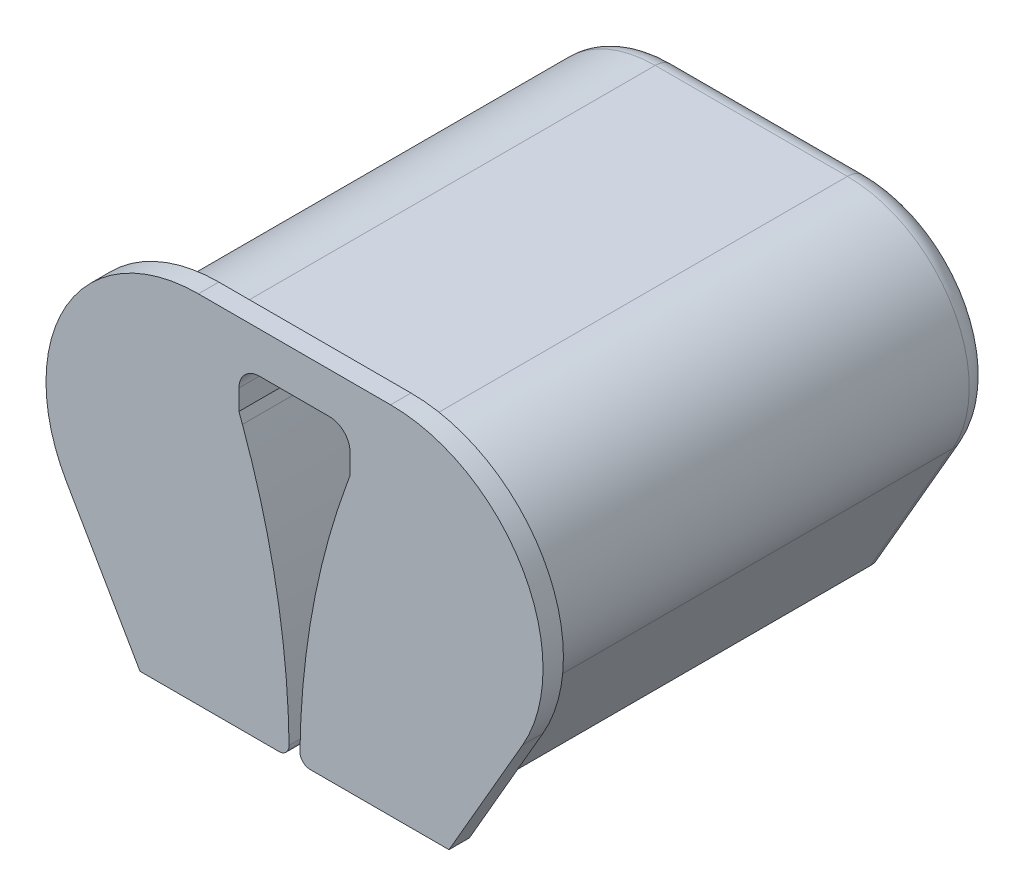
ISO-10303-21;
HEADER;
FILE_DESCRIPTION(('STEP AP214'),'2;1');
FILE_NAME('part.step','',(''),(''),'','','');
FILE_SCHEMA(('AUTOMOTIVE_DESIGN { 1 0 10303 214 1 1 1 1 }'));
ENDSEC;
DATA;
#1=APPLICATION_CONTEXT('core data for automotive mechanical design processes');
#2=APPLICATION_PROTOCOL_DEFINITION('international standard','automotive_design',2000,#1);
#3=PRODUCT_CONTEXT('',#1,'mechanical');
#4=PRODUCT('Part','Part','',(#3));
#5=PRODUCT_RELATED_PRODUCT_CATEGORY('part','',(#4));
#6=PRODUCT_DEFINITION_FORMATION('','',#4);
#7=PRODUCT_DEFINITION_CONTEXT('part definition',#1,'design');
#8=PRODUCT_DEFINITION('design','',#6,#7);
#9=PRODUCT_DEFINITION_SHAPE('','',#8);
#10=(LENGTH_UNIT() NAMED_UNIT(*) SI_UNIT(.MILLI.,.METRE.));
#11=(NAMED_UNIT(*) PLANE_ANGLE_UNIT() SI_UNIT($,.RADIAN.));
#12=(NAMED_UNIT(*) SI_UNIT($,.STERADIAN.) SOLID_ANGLE_UNIT());
#13=UNCERTAINTY_MEASURE_WITH_UNIT(LENGTH_MEASURE(1.E-05),#10,'distance_accuracy_value','');
#14=(GEOMETRIC_REPRESENTATION_CONTEXT(3) GLOBAL_UNCERTAINTY_ASSIGNED_CONTEXT((#13)) GLOBAL_UNIT_ASSIGNED_CONTEXT((#10,
#11,#12)) REPRESENTATION_CONTEXT('',''));
#15=CARTESIAN_POINT('',(0.,0.,0.));
#16=DIRECTION('',(0.,0.,1.));
#17=DIRECTION('',(1.,0.,0.));
#18=AXIS2_PLACEMENT_3D('',#15,#16,#17);
#19=CARTESIAN_POINT('',(0.,0.,-44.9));
#20=DIRECTION('',(0.,0.,-1.));
#21=DIRECTION('',(-1.,0.,0.));
#22=AXIS2_PLACEMENT_3D('',#19,#20,#21);
#23=PLANE('',#22);
#24=CARTESIAN_POINT('',(-76.525,-31.975,-44.9));
#25=DIRECTION('',(0.,0.,1.));
#26=DIRECTION('',(1.,0.,0.));
#27=AXIS2_PLACEMENT_3D('',#24,#25,#26);
#28=CIRCLE('',#27,76.);
#29=CARTESIAN_POINT('',(-0.531755855829166,-30.9616666666667,-44.9));
#30=VERTEX_POINT('',#29);
#31=CARTESIAN_POINT('',(-5.108360820271,-5.98146910724913,-44.9));
#32=VERTEX_POINT('',#31);
#33=EDGE_CURVE('E246',#30,#32,#28,.T.);
#34=ORIENTED_EDGE('',*,*,#33,.F.);
#35=CARTESIAN_POINT('',(-1.53166696298931,-30.975,-44.9));
#36=DIRECTION('',(0.,0.,-1.));
#37=DIRECTION('',(-1.,0.,0.));
#38=AXIS2_PLACEMENT_3D('',#35,#36,#37);
#39=CIRCLE('',#38,1.);
#40=CARTESIAN_POINT('',(-1.53166696298931,-31.975,-44.9));
#41=VERTEX_POINT('',#40);
#42=EDGE_CURVE('E12',#30,#41,#39,.T.);
#43=ORIENTED_EDGE('',*,*,#42,.T.);
#44=DIRECTION('',(1.,0.,0.));
#45=VECTOR('',#44,1.);
#46=CARTESIAN_POINT('',(-11.6887495373797,-31.975,-44.9));
#47=LINE('',#46,#45);
#48=CARTESIAN_POINT('',(-9.26387840678323,-31.975,-44.9));
#49=VERTEX_POINT('',#48);
#50=EDGE_CURVE('E459',#49,#41,#47,.T.);
#51=ORIENTED_EDGE('',*,*,#50,.F.);
#52=DIRECTION('',(0.500000000000001,-0.866025403784438,0.));
#53=VECTOR('',#52,1.);
#54=CARTESIAN_POINT('',(-20.7934899480912,-12.0051270189222,-44.9));
#55=LINE('',#54,#53);
#56=CARTESIAN_POINT('',(-17.9529999580871,-16.925,-44.9));
#57=VERTEX_POINT('',#56);
#58=EDGE_CURVE('E495',#49,#57,#55,.F.);
#59=ORIENTED_EDGE('',*,*,#58,.T.);
#60=CARTESIAN_POINT('',(-9.42264973081042,-12.,-44.9));
#61=DIRECTION('',(0.,0.,-1.));
#62=DIRECTION('',(-1.,0.,0.));
#63=AXIS2_PLACEMENT_3D('',#60,#61,#62);
#64=CIRCLE('',#63,9.84999999999999);
#65=CARTESIAN_POINT('',(-9.42264973081042,-2.15,-44.9));
#66=VERTEX_POINT('',#65);
#67=EDGE_CURVE('E492',#57,#66,#64,.T.);
#68=ORIENTED_EDGE('',*,*,#67,.T.);
#69=DIRECTION('',(-1.,0.,0.));
#70=VECTOR('',#69,1.);
#71=CARTESIAN_POINT('',(0.,-2.15,-44.9));
#72=LINE('',#71,#70);
#73=CARTESIAN_POINT('',(-5.23344495939737,-2.15,-44.9));
#74=VERTEX_POINT('',#73);
#75=EDGE_CURVE('E488',#66,#74,#72,.F.);
#76=ORIENTED_EDGE('',*,*,#75,.T.);
#77=CARTESIAN_POINT('',(-3.44738784944819,-3.05,-44.9));
#78=DIRECTION('',(0.,0.,1.));
#79=DIRECTION('',(1.,0.,0.));
#80=AXIS2_PLACEMENT_3D('',#77,#78,#79);
#81=CIRCLE('',#80,2.);
#82=CARTESIAN_POINT('',(-5.44738784944819,-3.05,-44.9));
#83=VERTEX_POINT('',#82);
#84=EDGE_CURVE('E293',#74,#83,#81,.T.);
#85=ORIENTED_EDGE('',*,*,#84,.T.);
#86=DIRECTION('',(0.,1.,0.));
#87=VECTOR('',#86,1.);
#88=CARTESIAN_POINT('',(-5.44738784944819,-5.05,-44.9));
#89=LINE('',#88,#87);
#90=CARTESIAN_POINT('',(-5.44738784944819,-5.05,-44.9));
#91=VERTEX_POINT('',#90);
#92=EDGE_CURVE('E290',#91,#83,#89,.T.);
#93=ORIENTED_EDGE('',*,*,#92,.F.);
#94=DIRECTION('',(-0.342020143325666,0.939692620785909,0.));
#95=VECTOR('',#94,1.);
#96=CARTESIAN_POINT('',(-5.108360820271,-5.98146910724913,-44.9));
#97=LINE('',#96,#95);
#98=EDGE_CURVE('E287',#32,#91,#97,.T.);
#99=ORIENTED_EDGE('',*,*,#98,.F.);
#100=EDGE_LOOP('',(#34,#43,#51,#59,#68,#76,#85,#93,#99));
#101=FACE_BOUND('',#100,.T.);
#102=ADVANCED_FACE('F48',(#101),#23,.T.);
#103=CARTESIAN_POINT('',(1.53166696298931,-31.975,-44.9));
#104=VERTEX_POINT('',#103);
#105=CARTESIAN_POINT('',(9.26387840678322,-31.975,-44.9));
#106=VERTEX_POINT('',#105);
#107=EDGE_CURVE('E463',#104,#106,#47,.T.);
#108=ORIENTED_EDGE('',*,*,#107,.F.);
#109=CARTESIAN_POINT('',(1.53166696298931,-30.975,-44.9));
#110=DIRECTION('',(0.,0.,-1.));
#111=DIRECTION('',(-1.,0.,0.));
#112=AXIS2_PLACEMENT_3D('',#109,#110,#111);
#113=CIRCLE('',#112,1.);
#114=CARTESIAN_POINT('',(0.531755855829166,-30.9616666666667,-44.9));
#115=VERTEX_POINT('',#114);
#116=EDGE_CURVE('E545',#104,#115,#113,.T.);
#117=ORIENTED_EDGE('',*,*,#116,.T.);
#118=CARTESIAN_POINT('',(76.525,-31.975,-44.9));
#119=DIRECTION('',(0.,0.,1.));
#120=DIRECTION('',(1.,0.,0.));
#121=AXIS2_PLACEMENT_3D('',#118,#119,#120);
#122=CIRCLE('',#121,76.);
#123=CARTESIAN_POINT('',(5.108360820271,-5.98146910724913,-44.9));
#124=VERTEX_POINT('',#123);
#125=EDGE_CURVE('E306',#124,#115,#122,.T.);
#126=ORIENTED_EDGE('',*,*,#125,.F.);
#127=DIRECTION('',(-0.342020143325666,-0.939692620785909,0.));
#128=VECTOR('',#127,1.);
#129=CARTESIAN_POINT('',(5.44738784944819,-5.05,-44.9));
#130=LINE('',#129,#128);
#131=CARTESIAN_POINT('',(5.44738784944819,-5.05,-44.9));
#132=VERTEX_POINT('',#131);
#133=EDGE_CURVE('E303',#132,#124,#130,.T.);
#134=ORIENTED_EDGE('',*,*,#133,.F.);
#135=DIRECTION('',(0.,-1.,0.));
#136=VECTOR('',#135,1.);
#137=CARTESIAN_POINT('',(5.44738784944819,-3.05,-44.9));
#138=LINE('',#137,#136);
#139=CARTESIAN_POINT('',(5.44738784944819,-3.05,-44.9));
#140=VERTEX_POINT('',#139);
#141=EDGE_CURVE('E300',#140,#132,#138,.T.);
#142=ORIENTED_EDGE('',*,*,#141,.F.);
#143=CARTESIAN_POINT('',(3.44738784944819,-3.05,-44.9));
#144=DIRECTION('',(0.,0.,-1.));
#145=DIRECTION('',(-1.,0.,0.));
#146=AXIS2_PLACEMENT_3D('',#143,#144,#145);
#147=CIRCLE('',#146,2.);
#148=CARTESIAN_POINT('',(5.23344495939737,-2.15,-44.9));
#149=VERTEX_POINT('',#148);
#150=EDGE_CURVE('E297',#149,#140,#147,.T.);
#151=ORIENTED_EDGE('',*,*,#150,.F.);
#152=CARTESIAN_POINT('',(9.42264973081039,-2.15,-44.9));
#153=VERTEX_POINT('',#152);
#154=EDGE_CURVE('E487',#149,#153,#72,.F.);
#155=ORIENTED_EDGE('',*,*,#154,.T.);
#156=CARTESIAN_POINT('',(9.42264973081041,-12.,-44.9));
#157=DIRECTION('',(0.,0.,-1.));
#158=DIRECTION('',(-1.,0.,0.));
#159=AXIS2_PLACEMENT_3D('',#156,#157,#158);
#160=CIRCLE('',#159,9.85);
#161=CARTESIAN_POINT('',(17.9529999580871,-16.925,-44.9));
#162=VERTEX_POINT('',#161);
#163=EDGE_CURVE('E484',#153,#162,#160,.T.);
#164=ORIENTED_EDGE('',*,*,#163,.T.);
#165=DIRECTION('',(0.500000000000001,0.866025403784438,0.));
#166=VECTOR('',#165,1.);
#167=CARTESIAN_POINT('',(20.7934899480911,-12.0051270189222,-44.9));
#168=LINE('',#167,#166);
#169=EDGE_CURVE('E498',#162,#106,#168,.F.);
#170=ORIENTED_EDGE('',*,*,#169,.T.);
#171=EDGE_LOOP('',(#108,#117,#126,#134,#142,#151,#155,#164,#170));
#172=FACE_BOUND('',#171,.T.);
#173=ADVANCED_FACE('F626',(#172),#23,.T.);
#174=CARTESIAN_POINT('',(-11.6887495373797,-31.975,-98.351347228197));
#175=DIRECTION('',(0.,-1.,0.));
#176=DIRECTION('',(1.,0.,0.));
#177=AXIS2_PLACEMENT_3D('',#174,#175,#176);
#178=PLANE('',#177);
#179=ORIENTED_EDGE('',*,*,#50,.T.);
#180=DIRECTION('',(0.,0.,1.));
#181=VECTOR('',#180,1.);
#182=CARTESIAN_POINT('',(-1.53166696298931,-31.975,-98.351347228197));
#183=LINE('',#182,#181);
#184=CARTESIAN_POINT('',(-1.53166696298931,-31.975,2.));
#185=VERTEX_POINT('',#184);
#186=EDGE_CURVE('E548',#41,#185,#183,.T.);
#187=ORIENTED_EDGE('',*,*,#186,.T.);
#188=DIRECTION('',(1.,0.,0.));
#189=VECTOR('',#188,1.);
#190=CARTESIAN_POINT('',(-15.1528511525174,-31.975,2.));
#191=LINE('',#190,#189);
#192=CARTESIAN_POINT('',(-15.1528511525174,-31.975,2.));
#193=VERTEX_POINT('',#192);
#194=EDGE_CURVE('E387',#193,#185,#191,.T.);
#195=ORIENTED_EDGE('',*,*,#194,.F.);
#196=DIRECTION('',(0.,0.,-1.));
#197=VECTOR('',#196,1.);
#198=CARTESIAN_POINT('',(-15.1528511525174,-31.975,2.));
#199=LINE('',#198,#197);
#200=CARTESIAN_POINT('',(-15.1528511525174,-31.975,0.));
#201=VERTEX_POINT('',#200);
#202=EDGE_CURVE('E420',#193,#201,#199,.T.);
#203=ORIENTED_EDGE('',*,*,#202,.T.);
#204=DIRECTION('',(1.,0.,0.));
#205=VECTOR('',#204,1.);
#206=CARTESIAN_POINT('',(-15.1528511525174,-31.975,0.));
#207=LINE('',#206,#205);
#208=CARTESIAN_POINT('',(-11.6887495373797,-31.975,0.));
#209=VERTEX_POINT('',#208);
#210=EDGE_CURVE('E407',#201,#209,#207,.T.);
#211=ORIENTED_EDGE('',*,*,#210,.T.);
#212=DIRECTION('',(0.,0.,1.));
#213=VECTOR('',#212,1.);
#214=CARTESIAN_POINT('',(-11.6887495373797,-31.975,-98.351347228197));
#215=LINE('',#214,#213);
#216=CARTESIAN_POINT('',(-11.6887495373797,-31.975,-42.8));
#217=VERTEX_POINT('',#216);
#218=EDGE_CURVE('E464',#217,#209,#215,.T.);
#219=ORIENTED_EDGE('',*,*,#218,.F.);
#220=CARTESIAN_POINT('',(-9.26387840678323,-31.975,-42.8));
#221=DIRECTION('',(0.,-1.,0.));
#222=DIRECTION('',(1.,0.,0.));
#223=AXIS2_PLACEMENT_3D('',#220,#221,#222);
#224=ELLIPSE('',#223,2.42487113059643,2.1);
#225=EDGE_CURVE('E502',#217,#49,#224,.T.);
#226=ORIENTED_EDGE('',*,*,#225,.T.);
#227=EDGE_LOOP('',(#179,#187,#195,#203,#211,#219,#226));
#228=FACE_BOUND('',#227,.T.);
#229=ADVANCED_FACE('F595',(#228),#178,.T.);
#230=CARTESIAN_POINT('',(1.53166696298931,-31.975,2.));
#231=VERTEX_POINT('',#230);
#232=CARTESIAN_POINT('',(15.1528511525174,-31.975,2.));
#233=VERTEX_POINT('',#232);
#234=EDGE_CURVE('E386',#231,#233,#191,.T.);
#235=ORIENTED_EDGE('',*,*,#234,.F.);
#236=DIRECTION('',(0.,0.,1.));
#237=VECTOR('',#236,1.);
#238=CARTESIAN_POINT('',(1.53166696298931,-31.975,-98.351347228197));
#239=LINE('',#238,#237);
#240=EDGE_CURVE('E542',#231,#104,#239,.F.);
#241=ORIENTED_EDGE('',*,*,#240,.T.);
#242=ORIENTED_EDGE('',*,*,#107,.T.);
#243=CARTESIAN_POINT('',(9.26387840678322,-31.975,-42.8));
#244=DIRECTION('',(0.,-1.,0.));
#245=DIRECTION('',(1.,0.,0.));
#246=AXIS2_PLACEMENT_3D('',#243,#244,#245);
#247=ELLIPSE('',#246,2.42487113059643,2.1);
#248=CARTESIAN_POINT('',(11.6887495373796,-31.975,-42.8));
#249=VERTEX_POINT('',#248);
#250=EDGE_CURVE('E505',#106,#249,#247,.T.);
#251=ORIENTED_EDGE('',*,*,#250,.T.);
#252=DIRECTION('',(0.,0.,1.));
#253=VECTOR('',#252,1.);
#254=CARTESIAN_POINT('',(11.6887495373796,-31.975,-98.351347228197));
#255=LINE('',#254,#253);
#256=CARTESIAN_POINT('',(11.6887495373796,-31.975,0.));
#257=VERTEX_POINT('',#256);
#258=EDGE_CURVE('E462',#249,#257,#255,.T.);
#259=ORIENTED_EDGE('',*,*,#258,.T.);
#260=CARTESIAN_POINT('',(15.1528511525174,-31.975,0.));
#261=VERTEX_POINT('',#260);
#262=EDGE_CURVE('E406',#257,#261,#207,.T.);
#263=ORIENTED_EDGE('',*,*,#262,.T.);
#264=DIRECTION('',(0.,0.,-1.));
#265=VECTOR('',#264,1.);
#266=CARTESIAN_POINT('',(15.1528511525174,-31.975,2.));
#267=LINE('',#266,#265);
#268=EDGE_CURVE('E416',#233,#261,#267,.T.);
#269=ORIENTED_EDGE('',*,*,#268,.F.);
#270=EDGE_LOOP('',(#235,#241,#242,#251,#259,#263,#269));
#271=FACE_BOUND('',#270,.T.);
#272=ADVANCED_FACE('F647',(#271),#178,.T.);
#273=CARTESIAN_POINT('',(9.42264973081041,-12.,2.));
#274=DIRECTION('',(0.,0.,1.));
#275=DIRECTION('',(1.,0.,0.));
#276=AXIS2_PLACEMENT_3D('',#273,#274,#275);
#277=PLANE('',#276);
#278=CARTESIAN_POINT('',(76.525,-31.975,2.));
#279=DIRECTION('',(0.,0.,1.));
#280=DIRECTION('',(1.,0.,0.));
#281=AXIS2_PLACEMENT_3D('',#278,#279,#280);
#282=CIRCLE('',#281,76.);
#283=CARTESIAN_POINT('',(5.108360820271,-5.98146910724913,2.));
#284=VERTEX_POINT('',#283);
#285=CARTESIAN_POINT('',(0.531755855829166,-30.9616666666667,2.));
#286=VERTEX_POINT('',#285);
#287=EDGE_CURVE('E282',#284,#286,#282,.T.);
#288=ORIENTED_EDGE('',*,*,#287,.T.);
#289=CARTESIAN_POINT('',(1.53166696298931,-30.975,2.));
#290=DIRECTION('',(0.,0.,1.));
#291=DIRECTION('',(1.,0.,0.));
#292=AXIS2_PLACEMENT_3D('',#289,#290,#291);
#293=CIRCLE('',#292,1.);
#294=EDGE_CURVE('E539',#286,#231,#293,.T.);
#295=ORIENTED_EDGE('',*,*,#294,.T.);
#296=ORIENTED_EDGE('',*,*,#234,.T.);
#297=DIRECTION('',(0.500000000000001,0.866025403784438,0.));
#298=VECTOR('',#297,1.);
#299=CARTESIAN_POINT('',(15.1528511525174,-31.975,2.));
#300=LINE('',#299,#298);
#301=CARTESIAN_POINT('',(22.3697295173877,-19.475,2.));
#302=VERTEX_POINT('',#301);
#303=EDGE_CURVE('E390',#233,#302,#300,.T.);
#304=ORIENTED_EDGE('',*,*,#303,.T.);
#305=CARTESIAN_POINT('',(9.42264973081041,-12.,2.));
#306=DIRECTION('',(0.,0.,1.));
#307=DIRECTION('',(1.,0.,0.));
#308=AXIS2_PLACEMENT_3D('',#305,#306,#307);
#309=CIRCLE('',#308,14.95);
#310=CARTESIAN_POINT('',(9.42264973081038,2.95,2.));
#311=VERTEX_POINT('',#310);
#312=EDGE_CURVE('E372',#302,#311,#309,.T.);
#313=ORIENTED_EDGE('',*,*,#312,.T.);
#314=DIRECTION('',(-1.,0.,0.));
#315=VECTOR('',#314,1.);
#316=CARTESIAN_POINT('',(9.42264973081038,2.95,2.));
#317=LINE('',#316,#315);
#318=CARTESIAN_POINT('',(-9.42264973081042,2.95,2.));
#319=VERTEX_POINT('',#318);
#320=EDGE_CURVE('E376',#311,#319,#317,.T.);
#321=ORIENTED_EDGE('',*,*,#320,.T.);
#322=CARTESIAN_POINT('',(-9.42264973081042,-12.,2.));
#323=DIRECTION('',(0.,0.,1.));
#324=DIRECTION('',(1.,0.,0.));
#325=AXIS2_PLACEMENT_3D('',#322,#323,#324);
#326=CIRCLE('',#325,14.95);
#327=CARTESIAN_POINT('',(-22.3697295173878,-19.475,2.));
#328=VERTEX_POINT('',#327);
#329=EDGE_CURVE('E380',#319,#328,#326,.T.);
#330=ORIENTED_EDGE('',*,*,#329,.T.);
#331=DIRECTION('',(0.500000000000001,-0.866025403784438,0.));
#332=VECTOR('',#331,1.);
#333=CARTESIAN_POINT('',(-22.3697295173878,-19.475,2.));
#334=LINE('',#333,#332);
#335=EDGE_CURVE('E383',#328,#193,#334,.T.);
#336=ORIENTED_EDGE('',*,*,#335,.T.);
#337=ORIENTED_EDGE('',*,*,#194,.T.);
#338=CARTESIAN_POINT('',(-1.53166696298931,-30.975,2.));
#339=DIRECTION('',(0.,0.,1.));
#340=DIRECTION('',(1.,0.,0.));
#341=AXIS2_PLACEMENT_3D('',#338,#339,#340);
#342=CIRCLE('',#341,1.);
#343=CARTESIAN_POINT('',(-0.531755855829166,-30.9616666666667,2.));
#344=VERTEX_POINT('',#343);
#345=EDGE_CURVE('E240',#185,#344,#342,.T.);
#346=ORIENTED_EDGE('',*,*,#345,.T.);
#347=CARTESIAN_POINT('',(-76.525,-31.975,2.));
#348=DIRECTION('',(0.,0.,1.));
#349=DIRECTION('',(1.,0.,0.));
#350=AXIS2_PLACEMENT_3D('',#347,#348,#349);
#351=CIRCLE('',#350,76.);
#352=CARTESIAN_POINT('',(-5.108360820271,-5.98146910724913,2.));
#353=VERTEX_POINT('',#352);
#354=EDGE_CURVE('E232',#344,#353,#351,.T.);
#355=ORIENTED_EDGE('',*,*,#354,.T.);
#356=DIRECTION('',(-0.342020143325666,0.939692620785909,0.));
#357=VECTOR('',#356,1.);
#358=CARTESIAN_POINT('',(-5.108360820271,-5.98146910724913,2.));
#359=LINE('',#358,#357);
#360=CARTESIAN_POINT('',(-5.44738784944819,-5.05,2.));
#361=VERTEX_POINT('',#360);
#362=EDGE_CURVE('E238',#353,#361,#359,.T.);
#363=ORIENTED_EDGE('',*,*,#362,.T.);
#364=DIRECTION('',(0.,1.,0.));
#365=VECTOR('',#364,1.);
#366=CARTESIAN_POINT('',(-5.44738784944819,-5.05,2.));
#367=LINE('',#366,#365);
#368=CARTESIAN_POINT('',(-5.44738784944819,-3.05,2.));
#369=VERTEX_POINT('',#368);
#370=EDGE_CURVE('E257',#361,#369,#367,.T.);
#371=ORIENTED_EDGE('',*,*,#370,.T.);
#372=CARTESIAN_POINT('',(-3.44738784944819,-3.05,2.));
#373=DIRECTION('',(0.,0.,1.));
#374=DIRECTION('',(1.,0.,0.));
#375=AXIS2_PLACEMENT_3D('',#372,#373,#374);
#376=CIRCLE('',#375,2.);
#377=CARTESIAN_POINT('',(-3.44738784944819,-1.05,2.));
#378=VERTEX_POINT('',#377);
#379=EDGE_CURVE('E260',#378,#369,#376,.T.);
#380=ORIENTED_EDGE('',*,*,#379,.F.);
#381=DIRECTION('',(1.,0.,0.));
#382=VECTOR('',#381,1.);
#383=CARTESIAN_POINT('',(-3.44738784944819,-1.05,2.));
#384=LINE('',#383,#382);
#385=CARTESIAN_POINT('',(3.44738784944819,-1.05,2.));
#386=VERTEX_POINT('',#385);
#387=EDGE_CURVE('E266',#378,#386,#384,.T.);
#388=ORIENTED_EDGE('',*,*,#387,.T.);
#389=CARTESIAN_POINT('',(3.44738784944819,-3.05,2.));
#390=DIRECTION('',(0.,0.,-1.));
#391=DIRECTION('',(-1.,0.,0.));
#392=AXIS2_PLACEMENT_3D('',#389,#390,#391);
#393=CIRCLE('',#392,2.);
#394=CARTESIAN_POINT('',(5.44738784944819,-3.05,2.));
#395=VERTEX_POINT('',#394);
#396=EDGE_CURVE('E270',#386,#395,#393,.T.);
#397=ORIENTED_EDGE('',*,*,#396,.T.);
#398=DIRECTION('',(0.,-1.,0.));
#399=VECTOR('',#398,1.);
#400=CARTESIAN_POINT('',(5.44738784944819,-3.05,2.));
#401=LINE('',#400,#399);
#402=CARTESIAN_POINT('',(5.44738784944819,-5.05,2.));
#403=VERTEX_POINT('',#402);
#404=EDGE_CURVE('E274',#395,#403,#401,.T.);
#405=ORIENTED_EDGE('',*,*,#404,.T.);
#406=DIRECTION('',(-0.342020143325666,-0.939692620785909,0.));
#407=VECTOR('',#406,1.);
#408=CARTESIAN_POINT('',(5.44738784944819,-5.05,2.));
#409=LINE('',#408,#407);
#410=EDGE_CURVE('E278',#403,#284,#409,.T.);
#411=ORIENTED_EDGE('',*,*,#410,.T.);
#412=EDGE_LOOP('',(#288,#295,#296,#304,#313,#321,#330,#336,#337,#346,#355,#363,#371,#380,#388,
#397,#405,#411));
#413=FACE_BOUND('',#412,.T.);
#414=ADVANCED_FACE('F235',(#413),#277,.T.);
#415=CARTESIAN_POINT('',(19.7716533060344,-17.975,-98.351347228197));
#416=DIRECTION('',(0.866025403784438,-0.500000000000001,0.));
#417=DIRECTION('',(0.500000000000001,0.866025403784438,0.));
#418=AXIS2_PLACEMENT_3D('',#415,#416,#417);
#419=PLANE('',#418);
#420=ORIENTED_EDGE('',*,*,#258,.F.);
#421=DIRECTION('',(0.500000000000001,0.866025403784438,0.));
#422=VECTOR('',#421,1.);
#423=CARTESIAN_POINT('',(19.7716533060344,-17.975,-42.8));
#424=LINE('',#423,#422);
#425=CARTESIAN_POINT('',(19.7716533060344,-17.975,-42.8));
#426=VERTEX_POINT('',#425);
#427=EDGE_CURVE('E480',#249,#426,#424,.T.);
#428=ORIENTED_EDGE('',*,*,#427,.T.);
#429=DIRECTION('',(0.,0.,1.));
#430=VECTOR('',#429,1.);
#431=CARTESIAN_POINT('',(19.7716533060344,-17.975,-98.351347228197));
#432=LINE('',#431,#430);
#433=CARTESIAN_POINT('',(19.7716533060344,-17.975,0.));
#434=VERTEX_POINT('',#433);
#435=EDGE_CURVE('E441',#426,#434,#432,.T.);
#436=ORIENTED_EDGE('',*,*,#435,.T.);
#437=DIRECTION('',(0.500000000000001,0.866025403784438,0.));
#438=VECTOR('',#437,1.);
#439=CARTESIAN_POINT('',(19.7716533060344,-17.975,0.));
#440=LINE('',#439,#438);
#441=EDGE_CURVE('E454',#257,#434,#440,.T.);
#442=ORIENTED_EDGE('',*,*,#441,.F.);
#443=EDGE_LOOP('',(#420,#428,#436,#442));
#444=FACE_BOUND('',#443,.T.);
#445=ADVANCED_FACE('F618',(#444),#419,.T.);
#446=CARTESIAN_POINT('',(9.42264973081041,-12.,-98.351347228197));
#447=DIRECTION('',(0.,0.,1.));
#448=DIRECTION('',(1.,0.,0.));
#449=AXIS2_PLACEMENT_3D('',#446,#447,#448);
#450=CYLINDRICAL_SURFACE('',#449,11.95);
#451=ORIENTED_EDGE('',*,*,#435,.F.);
#452=CARTESIAN_POINT('',(9.42264973081041,-12.,-42.8));
#453=DIRECTION('',(0.,0.,-1.));
#454=DIRECTION('',(-1.,0.,0.));
#455=AXIS2_PLACEMENT_3D('',#452,#453,#454);
#456=CIRCLE('',#455,11.95);
#457=CARTESIAN_POINT('',(9.42264973081039,-0.05,-42.8));
#458=VERTEX_POINT('',#457);
#459=EDGE_CURVE('E517',#426,#458,#456,.F.);
#460=ORIENTED_EDGE('',*,*,#459,.T.);
#461=DIRECTION('',(0.,0.,1.));
#462=VECTOR('',#461,1.);
#463=CARTESIAN_POINT('',(9.42264973081039,-0.05,-98.351347228197));
#464=LINE('',#463,#462);
#465=CARTESIAN_POINT('',(9.42264973081039,-0.05,0.));
#466=VERTEX_POINT('',#465);
#467=EDGE_CURVE('E473',#458,#466,#464,.T.);
#468=ORIENTED_EDGE('',*,*,#467,.T.);
#469=CARTESIAN_POINT('',(9.42264973081041,-12.,0.));
#470=DIRECTION('',(0.,0.,1.));
#471=DIRECTION('',(1.,0.,0.));
#472=AXIS2_PLACEMENT_3D('',#469,#470,#471);
#473=CIRCLE('',#472,11.95);
#474=EDGE_CURVE('E450',#434,#466,#473,.T.);
#475=ORIENTED_EDGE('',*,*,#474,.F.);
#476=EDGE_LOOP('',(#451,#460,#468,#475));
#477=FACE_BOUND('',#476,.T.);
#478=ADVANCED_FACE('F609',(#477),#450,.T.);
#479=CARTESIAN_POINT('',(-9.42264973081042,-0.0500000000000014,-98.351347228197));
#480=DIRECTION('',(0.,1.,0.));
#481=DIRECTION('',(-1.,0.,0.));
#482=AXIS2_PLACEMENT_3D('',#479,#480,#481);
#483=PLANE('',#482);
#484=ORIENTED_EDGE('',*,*,#467,.F.);
#485=DIRECTION('',(-1.,0.,0.));
#486=VECTOR('',#485,1.);
#487=CARTESIAN_POINT('',(-9.42264973081042,-0.0500000000000014,-42.8));
#488=LINE('',#487,#486);
#489=CARTESIAN_POINT('',(-9.42264973081042,-0.0500000000000032,-42.8));
#490=VERTEX_POINT('',#489);
#491=EDGE_CURVE('E514',#458,#490,#488,.T.);
#492=ORIENTED_EDGE('',*,*,#491,.T.);
#493=DIRECTION('',(0.,0.,1.));
#494=VECTOR('',#493,1.);
#495=CARTESIAN_POINT('',(-9.42264973081042,-0.0500000000000032,-98.351347228197));
#496=LINE('',#495,#494);
#497=CARTESIAN_POINT('',(-9.42264973081042,-0.0500000000000032,0.));
#498=VERTEX_POINT('',#497);
#499=EDGE_CURVE('E470',#490,#498,#496,.T.);
#500=ORIENTED_EDGE('',*,*,#499,.T.);
#501=DIRECTION('',(-1.,0.,0.));
#502=VECTOR('',#501,1.);
#503=CARTESIAN_POINT('',(-9.42264973081042,-0.0500000000000014,0.));
#504=LINE('',#503,#502);
#505=EDGE_CURVE('E446',#466,#498,#504,.T.);
#506=ORIENTED_EDGE('',*,*,#505,.F.);
#507=EDGE_LOOP('',(#484,#492,#500,#506));
#508=FACE_BOUND('',#507,.T.);
#509=ADVANCED_FACE('F606',(#508),#483,.T.);
#510=CARTESIAN_POINT('',(-9.42264973081042,-12.,-98.351347228197));
#511=DIRECTION('',(0.,0.,1.));
#512=DIRECTION('',(1.,0.,0.));
#513=AXIS2_PLACEMENT_3D('',#510,#511,#512);
#514=CYLINDRICAL_SURFACE('',#513,11.95);
#515=ORIENTED_EDGE('',*,*,#499,.F.);
#516=CARTESIAN_POINT('',(-9.42264973081042,-12.,-42.8));
#517=DIRECTION('',(0.,0.,-1.));
#518=DIRECTION('',(-1.,0.,0.));
#519=AXIS2_PLACEMENT_3D('',#516,#517,#518);
#520=CIRCLE('',#519,11.95);
#521=CARTESIAN_POINT('',(-19.7716533060344,-17.975,-42.8));
#522=VERTEX_POINT('',#521);
#523=EDGE_CURVE('E511',#490,#522,#520,.F.);
#524=ORIENTED_EDGE('',*,*,#523,.T.);
#525=DIRECTION('',(0.,0.,1.));
#526=VECTOR('',#525,1.);
#527=CARTESIAN_POINT('',(-19.7716533060344,-17.975,-98.351347228197));
#528=LINE('',#527,#526);
#529=CARTESIAN_POINT('',(-19.7716533060344,-17.975,0.));
#530=VERTEX_POINT('',#529);
#531=EDGE_CURVE('E467',#522,#530,#528,.T.);
#532=ORIENTED_EDGE('',*,*,#531,.T.);
#533=CARTESIAN_POINT('',(-9.42264973081042,-12.,0.));
#534=DIRECTION('',(0.,0.,1.));
#535=DIRECTION('',(1.,0.,0.));
#536=AXIS2_PLACEMENT_3D('',#533,#534,#535);
#537=CIRCLE('',#536,11.95);
#538=EDGE_CURVE('E442',#498,#530,#537,.T.);
#539=ORIENTED_EDGE('',*,*,#538,.F.);
#540=EDGE_LOOP('',(#515,#524,#532,#539));
#541=FACE_BOUND('',#540,.T.);
#542=ADVANCED_FACE('F583',(#541),#514,.T.);
#543=CARTESIAN_POINT('',(-11.6887495373797,-31.975,-98.351347228197));
#544=DIRECTION('',(-0.866025403784438,-0.500000000000001,0.));
#545=DIRECTION('',(0.500000000000001,-0.866025403784438,0.));
#546=AXIS2_PLACEMENT_3D('',#543,#544,#545);
#547=PLANE('',#546);
#548=ORIENTED_EDGE('',*,*,#531,.F.);
#549=DIRECTION('',(0.500000000000001,-0.866025403784438,0.));
#550=VECTOR('',#549,1.);
#551=CARTESIAN_POINT('',(-11.6887495373797,-31.975,-42.8));
#552=LINE('',#551,#550);
#553=EDGE_CURVE('E508',#522,#217,#552,.T.);
#554=ORIENTED_EDGE('',*,*,#553,.T.);
#555=ORIENTED_EDGE('',*,*,#218,.T.);
#556=DIRECTION('',(0.500000000000001,-0.866025403784438,0.));
#557=VECTOR('',#556,1.);
#558=CARTESIAN_POINT('',(-11.6887495373797,-31.975,0.));
#559=LINE('',#558,#557);
#560=EDGE_CURVE('E437',#530,#209,#559,.T.);
#561=ORIENTED_EDGE('',*,*,#560,.F.);
#562=EDGE_LOOP('',(#548,#554,#555,#561));
#563=FACE_BOUND('',#562,.T.);
#564=ADVANCED_FACE('F588',(#563),#547,.T.);
#565=CARTESIAN_POINT('',(-9.87009618943234,-30.925,-42.8));
#566=DIRECTION('',(0.500000000000001,-0.866025403784438,0.));
#567=DIRECTION('',(0.866025403784438,0.500000000000001,0.));
#568=AXIS2_PLACEMENT_3D('',#565,#566,#567);
#569=CYLINDRICAL_SURFACE('',#568,2.1);
#570=ORIENTED_EDGE('',*,*,#225,.F.);
#571=ORIENTED_EDGE('',*,*,#553,.F.);
#572=CARTESIAN_POINT('',(-17.9529999580871,-16.925,-42.8));
#573=DIRECTION('',(-0.500000000000001,0.866025403784438,0.));
#574=DIRECTION('',(-0.866025403784438,-0.500000000000001,0.));
#575=AXIS2_PLACEMENT_3D('',#572,#573,#574);
#576=CIRCLE('',#575,2.1);
#577=EDGE_CURVE('E458',#57,#522,#576,.T.);
#578=ORIENTED_EDGE('',*,*,#577,.F.);
#579=ORIENTED_EDGE('',*,*,#58,.F.);
#580=EDGE_LOOP('',(#570,#571,#578,#579));
#581=FACE_BOUND('',#580,.T.);
#582=ADVANCED_FACE('F592',(#581),#569,.T.);
#583=CARTESIAN_POINT('',(-9.42264973081042,-12.,-42.8));
#584=DIRECTION('',(0.,0.,-1.));
#585=DIRECTION('',(-1.,0.,0.));
#586=AXIS2_PLACEMENT_3D('',#583,#584,#585);
#587=TOROIDAL_SURFACE('',#586,9.84999999999999,2.1);
#588=ORIENTED_EDGE('',*,*,#577,.T.);
#589=ORIENTED_EDGE('',*,*,#523,.F.);
#590=CARTESIAN_POINT('',(-9.42264973081042,-2.15,-42.8));
#591=DIRECTION('',(1.,0.,0.));
#592=DIRECTION('',(0.,1.,0.));
#593=AXIS2_PLACEMENT_3D('',#590,#591,#592);
#594=CIRCLE('',#593,2.1);
#595=EDGE_CURVE('E527',#66,#490,#594,.T.);
#596=ORIENTED_EDGE('',*,*,#595,.F.);
#597=ORIENTED_EDGE('',*,*,#67,.F.);
#598=EDGE_LOOP('',(#588,#589,#596,#597));
#599=FACE_BOUND('',#598,.T.);
#600=ADVANCED_FACE('F578',(#599),#587,.T.);
#601=CARTESIAN_POINT('',(-9.42264973081042,-2.15,-42.8));
#602=DIRECTION('',(-1.,0.,0.));
#603=DIRECTION('',(0.,-1.,0.));
#604=AXIS2_PLACEMENT_3D('',#601,#602,#603);
#605=CYLINDRICAL_SURFACE('',#604,2.1);
#606=CARTESIAN_POINT('',(-5.23344495939737,-2.15,-44.9));
#607=CARTESIAN_POINT('',(-5.20958804746799,-2.10264317736367,-44.9000043417925));
#608=CARTESIAN_POINT('',(-5.18385971848024,-2.05628581016266,-44.8983979027241));
#609=CARTESIAN_POINT('',(-5.12893401004925,-1.9659382722236,-44.8924063821988));
#610=CARTESIAN_POINT('',(-5.0997410774017,-1.92194517016764,-44.8880248318972));
#611=CARTESIAN_POINT('',(-5.00774833946313,-1.7945395587818,-44.8714582056435));
#612=CARTESIAN_POINT('',(-4.94016222766694,-1.71496780908069,-44.8558374956995));
#613=CARTESIAN_POINT('',(-4.79467160240659,-1.56828411283365,-44.8192359137862));
#614=CARTESIAN_POINT('',(-4.7168145644695,-1.50111805890339,-44.7982793147837));
#615=CARTESIAN_POINT('',(-4.55185199868311,-1.37946550127388,-44.7546002667855));
#616=CARTESIAN_POINT('',(-4.46472032802889,-1.32501629891153,-44.7318728773761));
#617=CARTESIAN_POINT('',(-4.27276607636355,-1.22469563995687,-44.6860486834314));
#618=CARTESIAN_POINT('',(-4.16705085539832,-1.18041309524689,-44.6631832136396));
#619=CARTESIAN_POINT('',(-3.94853571599304,-1.11043720753938,-44.625084295172));
#620=CARTESIAN_POINT('',(-3.83576208043947,-1.0846788977642,-44.6098242317944));
#621=CARTESIAN_POINT('',(-3.67601281249287,-1.06258134046624,-44.5965415695666));
#622=CARTESIAN_POINT('',(-3.63047862332089,-1.05787103835292,-44.5936753725024));
#623=CARTESIAN_POINT('',(-3.53910133016672,-1.05157979897322,-44.5898277129871));
#624=CARTESIAN_POINT('',(-3.49325813161254,-1.04999986786306,-44.5888468565206));
#625=CARTESIAN_POINT('',(-3.44738784944819,-1.05,-44.5888543819998));
#626=B_SPLINE_CURVE_WITH_KNOTS('',3,(#606,#607,#608,#609,#610,#611,#612,#613,#614,#615,#616,
#617,#618,#619,#620,#621,#622,#623,#624,#625),.UNSPECIFIED.,.F.,.F.,(4,2,2,2,2,2,2,2,2,4),(0.,
0.158927952831444,0.317654084951939,0.632677296484539,0.946292301185659,1.2608159680971,
1.60973069861881,1.95741569409356,2.09489275369674,2.23241399367755),.UNSPECIFIED.);
#627=CARTESIAN_POINT('',(-3.44738784944819,-1.05,-44.5888543819998));
#628=VERTEX_POINT('',#627);
#629=EDGE_CURVE('E364',#74,#628,#626,.T.);
#630=ORIENTED_EDGE('',*,*,#629,.F.);
#631=ORIENTED_EDGE('',*,*,#75,.F.);
#632=ORIENTED_EDGE('',*,*,#595,.T.);
#633=ORIENTED_EDGE('',*,*,#491,.F.);
#634=CARTESIAN_POINT('',(9.42264973081039,-2.15,-42.8));
#635=DIRECTION('',(1.,0.,0.));
#636=DIRECTION('',(0.,0.,-1.));
#637=AXIS2_PLACEMENT_3D('',#634,#635,#636);
#638=CIRCLE('',#637,2.1);
#639=EDGE_CURVE('E523',#153,#458,#638,.T.);
#640=ORIENTED_EDGE('',*,*,#639,.F.);
#641=ORIENTED_EDGE('',*,*,#154,.F.);
#642=CARTESIAN_POINT('',(5.23344495939737,-2.15,-44.9));
#643=CARTESIAN_POINT('',(5.20958804746799,-2.10264317736367,-44.9000043417925));
#644=CARTESIAN_POINT('',(5.18385971848024,-2.05628581016266,-44.8983979027241));
#645=CARTESIAN_POINT('',(5.12893401004925,-1.9659382722236,-44.8924063821988));
#646=CARTESIAN_POINT('',(5.0997410774017,-1.92194517016764,-44.8880248318972));
#647=CARTESIAN_POINT('',(5.00774833946313,-1.7945395587818,-44.8714582056435));
#648=CARTESIAN_POINT('',(4.94016222766694,-1.71496780908069,-44.8558374956995));
#649=CARTESIAN_POINT('',(4.79467160240659,-1.56828411283365,-44.8192359137862));
#650=CARTESIAN_POINT('',(4.7168145644695,-1.50111805890339,-44.7982793147837));
#651=CARTESIAN_POINT('',(4.55185199868311,-1.37946550127388,-44.7546002667855));
#652=CARTESIAN_POINT('',(4.46472032802889,-1.32501629891153,-44.7318728773761));
#653=CARTESIAN_POINT('',(4.27276607636355,-1.22469563995687,-44.6860486834314));
#654=CARTESIAN_POINT('',(4.16705085539832,-1.18041309524689,-44.6631832136396));
#655=CARTESIAN_POINT('',(3.94853571599304,-1.11043720753938,-44.625084295172));
#656=CARTESIAN_POINT('',(3.83576208043947,-1.0846788977642,-44.6098242317944));
#657=CARTESIAN_POINT('',(3.67601281249287,-1.06258134046624,-44.5965415695666));
#658=CARTESIAN_POINT('',(3.63047862332089,-1.05787103835292,-44.5936753725024));
#659=CARTESIAN_POINT('',(3.53910133016672,-1.05157979897322,-44.5898277129871));
#660=CARTESIAN_POINT('',(3.49325813161254,-1.04999986786306,-44.5888468565206));
#661=CARTESIAN_POINT('',(3.44738784944819,-1.05,-44.5888543819998));
#662=B_SPLINE_CURVE_WITH_KNOTS('',3,(#642,#643,#644,#645,#646,#647,#648,#649,#650,#651,#652,
#653,#654,#655,#656,#657,#658,#659,#660,#661),.UNSPECIFIED.,.F.,.F.,(4,2,2,2,2,2,2,2,2,4),(0.,
0.158927952831445,0.317654084951939,0.632677296484539,0.94629230118566,1.2608159680971,
1.60973069861881,1.95741569409356,2.09489275369674,2.23241399367755),.UNSPECIFIED.);
#663=CARTESIAN_POINT('',(3.44738784944819,-1.05,-44.5888543819998));
#664=VERTEX_POINT('',#663);
#665=EDGE_CURVE('E250',#149,#664,#662,.T.);
#666=ORIENTED_EDGE('',*,*,#665,.T.);
#667=DIRECTION('',(-1.,0.,0.));
#668=VECTOR('',#667,1.);
#669=CARTESIAN_POINT('',(-9.42264973081042,-1.05,-44.5888543819998));
#670=LINE('',#669,#668);
#671=EDGE_CURVE('E339',#664,#628,#670,.T.);
#672=ORIENTED_EDGE('',*,*,#671,.T.);
#673=EDGE_LOOP('',(#630,#631,#632,#633,#640,#641,#666,#672));
#674=FACE_BOUND('',#673,.T.);
#675=ADVANCED_FACE('F341',(#674),#605,.T.);
#676=CARTESIAN_POINT('',(9.42264973081041,-12.,-42.8));
#677=DIRECTION('',(0.,0.,-1.));
#678=DIRECTION('',(-1.,0.,0.));
#679=AXIS2_PLACEMENT_3D('',#676,#677,#678);
#680=TOROIDAL_SURFACE('',#679,9.85,2.1);
#681=ORIENTED_EDGE('',*,*,#639,.T.);
#682=ORIENTED_EDGE('',*,*,#459,.F.);
#683=CARTESIAN_POINT('',(17.9529999580871,-16.925,-42.8));
#684=DIRECTION('',(-0.500000000000001,-0.866025403784438,0.));
#685=DIRECTION('',(0.866025403784438,-0.500000000000001,0.));
#686=AXIS2_PLACEMENT_3D('',#683,#684,#685);
#687=CIRCLE('',#686,2.1);
#688=EDGE_CURVE('E436',#162,#426,#687,.T.);
#689=ORIENTED_EDGE('',*,*,#688,.F.);
#690=ORIENTED_EDGE('',*,*,#163,.F.);
#691=EDGE_LOOP('',(#681,#682,#689,#690));
#692=FACE_BOUND('',#691,.T.);
#693=ADVANCED_FACE('F613',(#692),#680,.T.);
#694=CARTESIAN_POINT('',(17.9529999580871,-16.925,-42.8));
#695=DIRECTION('',(0.500000000000001,0.866025403784438,0.));
#696=DIRECTION('',(-0.866025403784438,0.500000000000001,0.));
#697=AXIS2_PLACEMENT_3D('',#694,#695,#696);
#698=CYLINDRICAL_SURFACE('',#697,2.1);
#699=ORIENTED_EDGE('',*,*,#250,.F.);
#700=ORIENTED_EDGE('',*,*,#169,.F.);
#701=ORIENTED_EDGE('',*,*,#688,.T.);
#702=ORIENTED_EDGE('',*,*,#427,.F.);
#703=EDGE_LOOP('',(#699,#700,#701,#702));
#704=FACE_BOUND('',#703,.T.);
#705=ADVANCED_FACE('F622',(#704),#698,.T.);
#706=CARTESIAN_POINT('',(9.42264973081041,-12.,0.));
#707=DIRECTION('',(0.,0.,1.));
#708=DIRECTION('',(1.,0.,0.));
#709=AXIS2_PLACEMENT_3D('',#706,#707,#708);
#710=PLANE('',#709);
#711=ORIENTED_EDGE('',*,*,#262,.F.);
#712=ORIENTED_EDGE('',*,*,#441,.T.);
#713=ORIENTED_EDGE('',*,*,#474,.T.);
#714=ORIENTED_EDGE('',*,*,#505,.T.);
#715=ORIENTED_EDGE('',*,*,#538,.T.);
#716=ORIENTED_EDGE('',*,*,#560,.T.);
#717=ORIENTED_EDGE('',*,*,#210,.F.);
#718=DIRECTION('',(0.500000000000001,-0.866025403784438,0.));
#719=VECTOR('',#718,1.);
#720=CARTESIAN_POINT('',(-22.3697295173878,-19.475,0.));
#721=LINE('',#720,#719);
#722=CARTESIAN_POINT('',(-22.3697295173878,-19.475,0.));
#723=VERTEX_POINT('',#722);
#724=EDGE_CURVE('E403',#723,#201,#721,.T.);
#725=ORIENTED_EDGE('',*,*,#724,.F.);
#726=CARTESIAN_POINT('',(-9.42264973081042,-12.,0.));
#727=DIRECTION('',(0.,0.,1.));
#728=DIRECTION('',(1.,0.,0.));
#729=AXIS2_PLACEMENT_3D('',#726,#727,#728);
#730=CIRCLE('',#729,14.95);
#731=CARTESIAN_POINT('',(-9.42264973081042,2.95,0.));
#732=VERTEX_POINT('',#731);
#733=EDGE_CURVE('E400',#732,#723,#730,.T.);
#734=ORIENTED_EDGE('',*,*,#733,.F.);
#735=DIRECTION('',(-1.,0.,0.));
#736=VECTOR('',#735,1.);
#737=CARTESIAN_POINT('',(9.42264973081038,2.95,0.));
#738=LINE('',#737,#736);
#739=CARTESIAN_POINT('',(9.42264973081038,2.95,0.));
#740=VERTEX_POINT('',#739);
#741=EDGE_CURVE('E397',#740,#732,#738,.T.);
#742=ORIENTED_EDGE('',*,*,#741,.F.);
#743=CARTESIAN_POINT('',(9.42264973081041,-12.,0.));
#744=DIRECTION('',(0.,0.,1.));
#745=DIRECTION('',(1.,0.,0.));
#746=AXIS2_PLACEMENT_3D('',#743,#744,#745);
#747=CIRCLE('',#746,14.95);
#748=CARTESIAN_POINT('',(22.3697295173877,-19.475,0.));
#749=VERTEX_POINT('',#748);
#750=EDGE_CURVE('E371',#749,#740,#747,.T.);
#751=ORIENTED_EDGE('',*,*,#750,.F.);
#752=DIRECTION('',(0.500000000000001,0.866025403784438,0.));
#753=VECTOR('',#752,1.);
#754=CARTESIAN_POINT('',(15.1528511525174,-31.975,0.));
#755=LINE('',#754,#753);
#756=EDGE_CURVE('E377',#261,#749,#755,.T.);
#757=ORIENTED_EDGE('',*,*,#756,.F.);
#758=EDGE_LOOP('',(#711,#712,#713,#714,#715,#716,#717,#725,#734,#742,#751,#757));
#759=FACE_BOUND('',#758,.T.);
#760=ADVANCED_FACE('F600',(#759),#710,.F.);
#761=CARTESIAN_POINT('',(9.42264973081041,-12.,2.));
#762=DIRECTION('',(0.,0.,-1.));
#763=DIRECTION('',(-1.,0.,0.));
#764=AXIS2_PLACEMENT_3D('',#761,#762,#763);
#765=CYLINDRICAL_SURFACE('',#764,14.95);
#766=ORIENTED_EDGE('',*,*,#750,.T.);
#767=DIRECTION('',(0.,0.,-1.));
#768=VECTOR('',#767,1.);
#769=CARTESIAN_POINT('',(9.42264973081038,2.95,2.));
#770=LINE('',#769,#768);
#771=EDGE_CURVE('E432',#311,#740,#770,.T.);
#772=ORIENTED_EDGE('',*,*,#771,.F.);
#773=ORIENTED_EDGE('',*,*,#312,.F.);
#774=DIRECTION('',(0.,0.,-1.));
#775=VECTOR('',#774,1.);
#776=CARTESIAN_POINT('',(22.3697295173877,-19.475,2.));
#777=LINE('',#776,#775);
#778=EDGE_CURVE('E393',#302,#749,#777,.T.);
#779=ORIENTED_EDGE('',*,*,#778,.T.);
#780=EDGE_LOOP('',(#766,#772,#773,#779));
#781=FACE_BOUND('',#780,.T.);
#782=ADVANCED_FACE('F657',(#781),#765,.T.);
#783=CARTESIAN_POINT('',(9.42264973081038,2.95,2.));
#784=DIRECTION('',(0.,-1.,0.));
#785=DIRECTION('',(1.,0.,0.));
#786=AXIS2_PLACEMENT_3D('',#783,#784,#785);
#787=PLANE('',#786);
#788=ORIENTED_EDGE('',*,*,#741,.T.);
#789=DIRECTION('',(0.,0.,-1.));
#790=VECTOR('',#789,1.);
#791=CARTESIAN_POINT('',(-9.42264973081042,2.95,2.));
#792=LINE('',#791,#790);
#793=EDGE_CURVE('E428',#319,#732,#792,.T.);
#794=ORIENTED_EDGE('',*,*,#793,.F.);
#795=ORIENTED_EDGE('',*,*,#320,.F.);
#796=ORIENTED_EDGE('',*,*,#771,.T.);
#797=EDGE_LOOP('',(#788,#794,#795,#796));
#798=FACE_BOUND('',#797,.T.);
#799=ADVANCED_FACE('F660',(#798),#787,.F.);
#800=CARTESIAN_POINT('',(-9.42264973081042,-12.,2.));
#801=DIRECTION('',(0.,0.,-1.));
#802=DIRECTION('',(-1.,0.,0.));
#803=AXIS2_PLACEMENT_3D('',#800,#801,#802);
#804=CYLINDRICAL_SURFACE('',#803,14.95);
#805=ORIENTED_EDGE('',*,*,#733,.T.);
#806=DIRECTION('',(0.,0.,-1.));
#807=VECTOR('',#806,1.);
#808=CARTESIAN_POINT('',(-22.3697295173878,-19.475,2.));
#809=LINE('',#808,#807);
#810=EDGE_CURVE('E424',#328,#723,#809,.T.);
#811=ORIENTED_EDGE('',*,*,#810,.F.);
#812=ORIENTED_EDGE('',*,*,#329,.F.);
#813=ORIENTED_EDGE('',*,*,#793,.T.);
#814=EDGE_LOOP('',(#805,#811,#812,#813));
#815=FACE_BOUND('',#814,.T.);
#816=ADVANCED_FACE('F665',(#815),#804,.T.);
#817=CARTESIAN_POINT('',(-22.3697295173878,-19.475,2.));
#818=DIRECTION('',(0.866025403784438,0.500000000000001,0.));
#819=DIRECTION('',(-0.500000000000001,0.866025403784438,0.));
#820=AXIS2_PLACEMENT_3D('',#817,#818,#819);
#821=PLANE('',#820);
#822=ORIENTED_EDGE('',*,*,#724,.T.);
#823=ORIENTED_EDGE('',*,*,#202,.F.);
#824=ORIENTED_EDGE('',*,*,#335,.F.);
#825=ORIENTED_EDGE('',*,*,#810,.T.);
#826=EDGE_LOOP('',(#822,#823,#824,#825));
#827=FACE_BOUND('',#826,.T.);
#828=ADVANCED_FACE('F670',(#827),#821,.F.);
#829=CARTESIAN_POINT('',(15.1528511525174,-31.975,2.));
#830=DIRECTION('',(-0.866025403784438,0.500000000000001,0.));
#831=DIRECTION('',(-0.500000000000001,-0.866025403784438,0.));
#832=AXIS2_PLACEMENT_3D('',#829,#830,#831);
#833=PLANE('',#832);
#834=ORIENTED_EDGE('',*,*,#756,.T.);
#835=ORIENTED_EDGE('',*,*,#778,.F.);
#836=ORIENTED_EDGE('',*,*,#303,.F.);
#837=ORIENTED_EDGE('',*,*,#268,.T.);
#838=EDGE_LOOP('',(#834,#835,#836,#837));
#839=FACE_BOUND('',#838,.T.);
#840=ADVANCED_FACE('F652',(#839),#833,.F.);
#841=CARTESIAN_POINT('',(-76.525,-31.975,-44.9));
#842=DIRECTION('',(0.,0.,1.));
#843=DIRECTION('',(1.,0.,0.));
#844=AXIS2_PLACEMENT_3D('',#841,#842,#843);
#845=CYLINDRICAL_SURFACE('',#844,76.);
#846=ORIENTED_EDGE('',*,*,#354,.F.);
#847=DIRECTION('',(0.,0.,1.));
#848=VECTOR('',#847,1.);
#849=CARTESIAN_POINT('',(-0.531755855829166,-30.9616666666667,-44.9));
#850=LINE('',#849,#848);
#851=EDGE_CURVE('E57',#344,#30,#850,.F.);
#852=ORIENTED_EDGE('',*,*,#851,.T.);
#853=ORIENTED_EDGE('',*,*,#33,.T.);
#854=DIRECTION('',(0.,0.,1.));
#855=VECTOR('',#854,1.);
#856=CARTESIAN_POINT('',(-5.108360820271,-5.98146910724913,-44.9));
#857=LINE('',#856,#855);
#858=EDGE_CURVE('E244',#32,#353,#857,.T.);
#859=ORIENTED_EDGE('',*,*,#858,.T.);
#860=EDGE_LOOP('',(#846,#852,#853,#859));
#861=FACE_BOUND('',#860,.T.);
#862=ADVANCED_FACE('F245',(#861),#845,.T.);
#863=CARTESIAN_POINT('',(-5.108360820271,-5.98146910724913,-44.9));
#864=DIRECTION('',(0.939692620785909,0.342020143325666,0.));
#865=DIRECTION('',(-0.342020143325666,0.93969262078591,0.));
#866=AXIS2_PLACEMENT_3D('',#863,#864,#865);
#867=PLANE('',#866);
#868=ORIENTED_EDGE('',*,*,#858,.F.);
#869=ORIENTED_EDGE('',*,*,#98,.T.);
#870=DIRECTION('',(0.,0.,1.));
#871=VECTOR('',#870,1.);
#872=CARTESIAN_POINT('',(-5.44738784944819,-5.05,-44.9));
#873=LINE('',#872,#871);
#874=EDGE_CURVE('E251',#91,#361,#873,.T.);
#875=ORIENTED_EDGE('',*,*,#874,.T.);
#876=ORIENTED_EDGE('',*,*,#362,.F.);
#877=EDGE_LOOP('',(#868,#869,#875,#876));
#878=FACE_BOUND('',#877,.T.);
#879=ADVANCED_FACE('F253',(#878),#867,.T.);
#880=CARTESIAN_POINT('',(-5.44738784944819,-5.05,-44.9));
#881=DIRECTION('',(1.,0.,0.));
#882=DIRECTION('',(0.,0.,-1.));
#883=AXIS2_PLACEMENT_3D('',#880,#881,#882);
#884=PLANE('',#883);
#885=ORIENTED_EDGE('',*,*,#874,.F.);
#886=ORIENTED_EDGE('',*,*,#92,.T.);
#887=DIRECTION('',(0.,0.,1.));
#888=VECTOR('',#887,1.);
#889=CARTESIAN_POINT('',(-5.44738784944819,-3.05,-44.9));
#890=LINE('',#889,#888);
#891=EDGE_CURVE('E325',#83,#369,#890,.T.);
#892=ORIENTED_EDGE('',*,*,#891,.T.);
#893=ORIENTED_EDGE('',*,*,#370,.F.);
#894=EDGE_LOOP('',(#885,#886,#892,#893));
#895=FACE_BOUND('',#894,.T.);
#896=ADVANCED_FACE('F361',(#895),#884,.T.);
#897=CARTESIAN_POINT('',(-3.44738784944819,-3.05,-44.9));
#898=DIRECTION('',(0.,0.,1.));
#899=DIRECTION('',(1.,0.,0.));
#900=AXIS2_PLACEMENT_3D('',#897,#898,#899);
#901=CYLINDRICAL_SURFACE('',#900,2.);
#902=ORIENTED_EDGE('',*,*,#629,.T.);
#903=DIRECTION('',(0.,0.,1.));
#904=VECTOR('',#903,1.);
#905=CARTESIAN_POINT('',(-3.44738784944819,-1.05,-44.9));
#906=LINE('',#905,#904);
#907=EDGE_CURVE('E322',#628,#378,#906,.T.);
#908=ORIENTED_EDGE('',*,*,#907,.T.);
#909=ORIENTED_EDGE('',*,*,#379,.T.);
#910=ORIENTED_EDGE('',*,*,#891,.F.);
#911=ORIENTED_EDGE('',*,*,#84,.F.);
#912=EDGE_LOOP('',(#902,#908,#909,#910,#911));
#913=FACE_BOUND('',#912,.T.);
#914=ADVANCED_FACE('F356',(#913),#901,.F.);
#915=CARTESIAN_POINT('',(-3.44738784944819,-1.05,-44.9));
#916=DIRECTION('',(0.,-1.,0.));
#917=DIRECTION('',(0.,0.,-1.));
#918=AXIS2_PLACEMENT_3D('',#915,#916,#917);
#919=PLANE('',#918);
#920=DIRECTION('',(0.,0.,1.));
#921=VECTOR('',#920,1.);
#922=CARTESIAN_POINT('',(3.44738784944819,-1.05,-44.9));
#923=LINE('',#922,#921);
#924=EDGE_CURVE('E319',#664,#386,#923,.T.);
#925=ORIENTED_EDGE('',*,*,#924,.T.);
#926=ORIENTED_EDGE('',*,*,#387,.F.);
#927=ORIENTED_EDGE('',*,*,#907,.F.);
#928=ORIENTED_EDGE('',*,*,#671,.F.);
#929=EDGE_LOOP('',(#925,#926,#927,#928));
#930=FACE_BOUND('',#929,.T.);
#931=ADVANCED_FACE('F351',(#930),#919,.T.);
#932=CARTESIAN_POINT('',(3.44738784944819,-3.05,-44.9));
#933=DIRECTION('',(0.,0.,1.));
#934=DIRECTION('',(1.,0.,0.));
#935=AXIS2_PLACEMENT_3D('',#932,#933,#934);
#936=CYLINDRICAL_SURFACE('',#935,2.);
#937=ORIENTED_EDGE('',*,*,#150,.T.);
#938=DIRECTION('',(0.,0.,1.));
#939=VECTOR('',#938,1.);
#940=CARTESIAN_POINT('',(5.44738784944819,-3.05,-44.9));
#941=LINE('',#940,#939);
#942=EDGE_CURVE('E316',#140,#395,#941,.T.);
#943=ORIENTED_EDGE('',*,*,#942,.T.);
#944=ORIENTED_EDGE('',*,*,#396,.F.);
#945=ORIENTED_EDGE('',*,*,#924,.F.);
#946=ORIENTED_EDGE('',*,*,#665,.F.);
#947=EDGE_LOOP('',(#937,#943,#944,#945,#946));
#948=FACE_BOUND('',#947,.T.);
#949=ADVANCED_FACE('F345',(#948),#936,.F.);
#950=CARTESIAN_POINT('',(5.44738784944819,-3.05,-44.9));
#951=DIRECTION('',(-1.,0.,0.));
#952=DIRECTION('',(0.,0.,1.));
#953=AXIS2_PLACEMENT_3D('',#950,#951,#952);
#954=PLANE('',#953);
#955=ORIENTED_EDGE('',*,*,#942,.F.);
#956=ORIENTED_EDGE('',*,*,#141,.T.);
#957=DIRECTION('',(0.,0.,1.));
#958=VECTOR('',#957,1.);
#959=CARTESIAN_POINT('',(5.44738784944819,-5.05,-44.9));
#960=LINE('',#959,#958);
#961=EDGE_CURVE('E313',#132,#403,#960,.T.);
#962=ORIENTED_EDGE('',*,*,#961,.T.);
#963=ORIENTED_EDGE('',*,*,#404,.F.);
#964=EDGE_LOOP('',(#955,#956,#962,#963));
#965=FACE_BOUND('',#964,.T.);
#966=ADVANCED_FACE('F350',(#965),#954,.T.);
#967=CARTESIAN_POINT('',(5.44738784944819,-5.05,-44.9));
#968=DIRECTION('',(-0.939692620785909,0.342020143325666,0.));
#969=DIRECTION('',(-0.342020143325666,-0.93969262078591,0.));
#970=AXIS2_PLACEMENT_3D('',#967,#968,#969);
#971=PLANE('',#970);
#972=ORIENTED_EDGE('',*,*,#961,.F.);
#973=ORIENTED_EDGE('',*,*,#133,.T.);
#974=DIRECTION('',(0.,0.,1.));
#975=VECTOR('',#974,1.);
#976=CARTESIAN_POINT('',(5.108360820271,-5.98146910724913,-44.9));
#977=LINE('',#976,#975);
#978=EDGE_CURVE('E310',#124,#284,#977,.T.);
#979=ORIENTED_EDGE('',*,*,#978,.T.);
#980=ORIENTED_EDGE('',*,*,#410,.F.);
#981=EDGE_LOOP('',(#972,#973,#979,#980));
#982=FACE_BOUND('',#981,.T.);
#983=ADVANCED_FACE('F635',(#982),#971,.T.);
#984=CARTESIAN_POINT('',(76.525,-31.975,-44.9));
#985=DIRECTION('',(0.,0.,1.));
#986=DIRECTION('',(1.,0.,0.));
#987=AXIS2_PLACEMENT_3D('',#984,#985,#986);
#988=CYLINDRICAL_SURFACE('',#987,76.);
#989=ORIENTED_EDGE('',*,*,#125,.T.);
#990=DIRECTION('',(0.,0.,1.));
#991=VECTOR('',#990,1.);
#992=CARTESIAN_POINT('',(0.531755855829166,-30.9616666666667,-44.9));
#993=LINE('',#992,#991);
#994=EDGE_CURVE('E520',#115,#286,#993,.T.);
#995=ORIENTED_EDGE('',*,*,#994,.T.);
#996=ORIENTED_EDGE('',*,*,#287,.F.);
#997=ORIENTED_EDGE('',*,*,#978,.F.);
#998=EDGE_LOOP('',(#989,#995,#996,#997));
#999=FACE_BOUND('',#998,.T.);
#1000=ADVANCED_FACE('F639',(#999),#988,.T.);
#1001=CARTESIAN_POINT('',(1.53166696298931,-30.975,-44.9));
#1002=DIRECTION('',(0.,0.,1.));
#1003=DIRECTION('',(1.,0.,0.));
#1004=AXIS2_PLACEMENT_3D('',#1001,#1002,#1003);
#1005=CYLINDRICAL_SURFACE('',#1004,1.);
#1006=ORIENTED_EDGE('',*,*,#116,.F.);
#1007=ORIENTED_EDGE('',*,*,#240,.F.);
#1008=ORIENTED_EDGE('',*,*,#294,.F.);
#1009=ORIENTED_EDGE('',*,*,#994,.F.);
#1010=EDGE_LOOP('',(#1006,#1007,#1008,#1009));
#1011=FACE_BOUND('',#1010,.T.);
#1012=ADVANCED_FACE('F642',(#1011),#1005,.T.);
#1013=CARTESIAN_POINT('',(-1.53166696298931,-30.975,-44.9));
#1014=DIRECTION('',(0.,0.,1.));
#1015=DIRECTION('',(1.,0.,0.));
#1016=AXIS2_PLACEMENT_3D('',#1013,#1014,#1015);
#1017=CYLINDRICAL_SURFACE('',#1016,1.);
#1018=ORIENTED_EDGE('',*,*,#42,.F.);
#1019=ORIENTED_EDGE('',*,*,#851,.F.);
#1020=ORIENTED_EDGE('',*,*,#345,.F.);
#1021=ORIENTED_EDGE('',*,*,#186,.F.);
#1022=EDGE_LOOP('',(#1018,#1019,#1020,#1021));
#1023=FACE_BOUND('',#1022,.T.);
#1024=ADVANCED_FACE('F50',(#1023),#1017,.T.);
#1025=CLOSED_SHELL('',(#102,#173,#229,#272,#414,#445,#478,#509,#542,#564,#582,#600,#675,#693,
#705,#760,#782,#799,#816,#828,#840,#862,#879,#896,#914,#931,#949,#966,#983,#1000,#1012,#1024));
#1026=MANIFOLD_SOLID_BREP('B2',#1025);
#1027=ADVANCED_BREP_SHAPE_REPRESENTATION('',(#18,#1026),#14);
#1028=SHAPE_DEFINITION_REPRESENTATION(#9,#1027);
ENDSEC;
END-ISO-10303-21;
